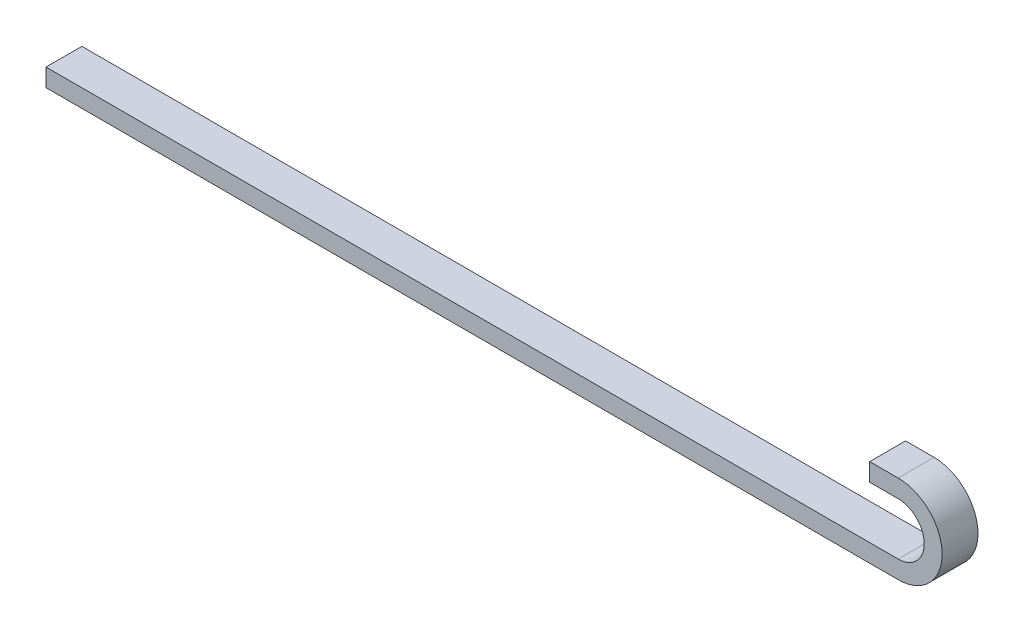
ISO-10303-21;
HEADER;
FILE_DESCRIPTION(('STEP AP214'),'2;1');
FILE_NAME('part.step','',(''),(''),'','','');
FILE_SCHEMA(('AUTOMOTIVE_DESIGN { 1 0 10303 214 1 1 1 1 }'));
ENDSEC;
DATA;
#1=APPLICATION_CONTEXT('core data for automotive mechanical design processes');
#2=APPLICATION_PROTOCOL_DEFINITION('international standard','automotive_design',2000,#1);
#3=PRODUCT_CONTEXT('',#1,'mechanical');
#4=PRODUCT('Part','Part','',(#3));
#5=PRODUCT_RELATED_PRODUCT_CATEGORY('part','',(#4));
#6=PRODUCT_DEFINITION_FORMATION('','',#4);
#7=PRODUCT_DEFINITION_CONTEXT('part definition',#1,'design');
#8=PRODUCT_DEFINITION('design','',#6,#7);
#9=PRODUCT_DEFINITION_SHAPE('','',#8);
#10=(LENGTH_UNIT() NAMED_UNIT(*) SI_UNIT(.MILLI.,.METRE.));
#11=(NAMED_UNIT(*) PLANE_ANGLE_UNIT() SI_UNIT($,.RADIAN.));
#12=(NAMED_UNIT(*) SI_UNIT($,.STERADIAN.) SOLID_ANGLE_UNIT());
#13=UNCERTAINTY_MEASURE_WITH_UNIT(LENGTH_MEASURE(1.E-05),#10,'distance_accuracy_value','');
#14=(GEOMETRIC_REPRESENTATION_CONTEXT(3) GLOBAL_UNCERTAINTY_ASSIGNED_CONTEXT((#13)) GLOBAL_UNIT_ASSIGNED_CONTEXT((#10,
#11,#12)) REPRESENTATION_CONTEXT('',''));
#15=CARTESIAN_POINT('',(0.,0.,0.));
#16=DIRECTION('',(0.,0.,1.));
#17=DIRECTION('',(1.,0.,0.));
#18=AXIS2_PLACEMENT_3D('',#15,#16,#17);
#19=CARTESIAN_POINT('',(-600.,0.,12.625));
#20=DIRECTION('',(1.,0.,0.));
#21=DIRECTION('',(0.,0.,-1.));
#22=AXIS2_PLACEMENT_3D('',#19,#20,#21);
#23=PLANE('',#22);
#24=DIRECTION('',(0.,-1.,0.));
#25=VECTOR('',#24,1.);
#26=CARTESIAN_POINT('',(-600.,0.,-12.625));
#27=LINE('',#26,#25);
#28=CARTESIAN_POINT('',(-600.,12.6,-12.625));
#29=VERTEX_POINT('',#28);
#30=CARTESIAN_POINT('',(-600.,0.,-12.625));
#31=VERTEX_POINT('',#30);
#32=EDGE_CURVE('E128',#29,#31,#27,.T.);
#33=ORIENTED_EDGE('',*,*,#32,.T.);
#34=DIRECTION('',(0.,0.,-1.));
#35=VECTOR('',#34,1.);
#36=CARTESIAN_POINT('',(-600.,0.,12.625));
#37=LINE('',#36,#35);
#38=CARTESIAN_POINT('',(-600.,0.,12.625));
#39=VERTEX_POINT('',#38);
#40=EDGE_CURVE('E11',#39,#31,#37,.T.);
#41=ORIENTED_EDGE('',*,*,#40,.F.);
#42=DIRECTION('',(0.,-1.,0.));
#43=VECTOR('',#42,1.);
#44=CARTESIAN_POINT('',(-600.,0.,12.625));
#45=LINE('',#44,#43);
#46=CARTESIAN_POINT('',(-600.,12.6,12.625));
#47=VERTEX_POINT('',#46);
#48=EDGE_CURVE('E142',#47,#39,#45,.T.);
#49=ORIENTED_EDGE('',*,*,#48,.F.);
#50=DIRECTION('',(0.,0.,-1.));
#51=VECTOR('',#50,1.);
#52=CARTESIAN_POINT('',(-600.,12.6,12.625));
#53=LINE('',#52,#51);
#54=EDGE_CURVE('E124',#47,#29,#53,.T.);
#55=ORIENTED_EDGE('',*,*,#54,.T.);
#56=EDGE_LOOP('',(#33,#41,#49,#55));
#57=FACE_BOUND('',#56,.T.);
#58=ADVANCED_FACE('F32',(#57),#23,.F.);
#59=CARTESIAN_POINT('',(-600.,0.,12.625));
#60=DIRECTION('',(0.,1.,0.));
#61=DIRECTION('',(0.,0.,1.));
#62=AXIS2_PLACEMENT_3D('',#59,#60,#61);
#63=PLANE('',#62);
#64=DIRECTION('',(1.,0.,0.));
#65=VECTOR('',#64,1.);
#66=CARTESIAN_POINT('',(-600.,0.,-12.625));
#67=LINE('',#66,#65);
#68=CARTESIAN_POINT('',(0.,0.,-12.625));
#69=VERTEX_POINT('',#68);
#70=EDGE_CURVE('E131',#31,#69,#67,.T.);
#71=ORIENTED_EDGE('',*,*,#70,.T.);
#72=DIRECTION('',(0.,0.,-1.));
#73=VECTOR('',#72,1.);
#74=CARTESIAN_POINT('',(0.,0.,12.625));
#75=LINE('',#74,#73);
#76=CARTESIAN_POINT('',(0.,0.,12.625));
#77=VERTEX_POINT('',#76);
#78=EDGE_CURVE('E40',#77,#69,#75,.T.);
#79=ORIENTED_EDGE('',*,*,#78,.F.);
#80=DIRECTION('',(1.,0.,0.));
#81=VECTOR('',#80,1.);
#82=CARTESIAN_POINT('',(-600.,0.,12.625));
#83=LINE('',#82,#81);
#84=EDGE_CURVE('E91',#39,#77,#83,.T.);
#85=ORIENTED_EDGE('',*,*,#84,.F.);
#86=ORIENTED_EDGE('',*,*,#40,.T.);
#87=EDGE_LOOP('',(#71,#79,#85,#86));
#88=FACE_BOUND('',#87,.T.);
#89=ADVANCED_FACE('F177',(#88),#63,.F.);
#90=CARTESIAN_POINT('',(0.,31.,12.625));
#91=DIRECTION('',(0.,0.,-1.));
#92=DIRECTION('',(-1.,0.,0.));
#93=AXIS2_PLACEMENT_3D('',#90,#91,#92);
#94=CYLINDRICAL_SURFACE('',#93,31.);
#95=CARTESIAN_POINT('',(0.,31.,-12.625));
#96=DIRECTION('',(0.,0.,1.));
#97=DIRECTION('',(1.,0.,0.));
#98=AXIS2_PLACEMENT_3D('',#95,#96,#97);
#99=CIRCLE('',#98,31.);
#100=CARTESIAN_POINT('',(0.,62.,-12.625));
#101=VERTEX_POINT('',#100);
#102=EDGE_CURVE('E133',#69,#101,#99,.T.);
#103=ORIENTED_EDGE('',*,*,#102,.T.);
#104=DIRECTION('',(0.,0.,-1.));
#105=VECTOR('',#104,1.);
#106=CARTESIAN_POINT('',(0.,62.,12.625));
#107=LINE('',#106,#105);
#108=CARTESIAN_POINT('',(0.,62.,12.625));
#109=VERTEX_POINT('',#108);
#110=EDGE_CURVE('E149',#109,#101,#107,.T.);
#111=ORIENTED_EDGE('',*,*,#110,.F.);
#112=CARTESIAN_POINT('',(0.,31.,12.625));
#113=DIRECTION('',(0.,0.,1.));
#114=DIRECTION('',(1.,0.,0.));
#115=AXIS2_PLACEMENT_3D('',#112,#113,#114);
#116=CIRCLE('',#115,31.);
#117=EDGE_CURVE('E157',#77,#109,#116,.T.);
#118=ORIENTED_EDGE('',*,*,#117,.F.);
#119=ORIENTED_EDGE('',*,*,#78,.T.);
#120=EDGE_LOOP('',(#103,#111,#118,#119));
#121=FACE_BOUND('',#120,.T.);
#122=ADVANCED_FACE('F155',(#121),#94,.T.);
#123=CARTESIAN_POINT('',(0.,62.,12.625));
#124=DIRECTION('',(0.,-1.,0.));
#125=DIRECTION('',(1.,0.,0.));
#126=AXIS2_PLACEMENT_3D('',#123,#124,#125);
#127=PLANE('',#126);
#128=DIRECTION('',(-1.,0.,0.));
#129=VECTOR('',#128,1.);
#130=CARTESIAN_POINT('',(0.,62.,-12.625));
#131=LINE('',#130,#129);
#132=CARTESIAN_POINT('',(-20.,62.,-12.625));
#133=VERTEX_POINT('',#132);
#134=EDGE_CURVE('E135',#101,#133,#131,.T.);
#135=ORIENTED_EDGE('',*,*,#134,.T.);
#136=DIRECTION('',(0.,0.,-1.));
#137=VECTOR('',#136,1.);
#138=CARTESIAN_POINT('',(-20.,62.,12.625));
#139=LINE('',#138,#137);
#140=CARTESIAN_POINT('',(-20.,62.,12.625));
#141=VERTEX_POINT('',#140);
#142=EDGE_CURVE('E146',#141,#133,#139,.T.);
#143=ORIENTED_EDGE('',*,*,#142,.F.);
#144=DIRECTION('',(-1.,0.,0.));
#145=VECTOR('',#144,1.);
#146=CARTESIAN_POINT('',(0.,62.,12.625));
#147=LINE('',#146,#145);
#148=EDGE_CURVE('E169',#109,#141,#147,.T.);
#149=ORIENTED_EDGE('',*,*,#148,.F.);
#150=ORIENTED_EDGE('',*,*,#110,.T.);
#151=EDGE_LOOP('',(#135,#143,#149,#150));
#152=FACE_BOUND('',#151,.T.);
#153=ADVANCED_FACE('F165',(#152),#127,.F.);
#154=CARTESIAN_POINT('',(-20.,49.4,12.625));
#155=DIRECTION('',(1.,0.,0.));
#156=DIRECTION('',(0.,0.,-1.));
#157=AXIS2_PLACEMENT_3D('',#154,#155,#156);
#158=PLANE('',#157);
#159=DIRECTION('',(0.,-1.,0.));
#160=VECTOR('',#159,1.);
#161=CARTESIAN_POINT('',(-20.,49.4,-12.625));
#162=LINE('',#161,#160);
#163=CARTESIAN_POINT('',(-20.,49.4,-12.625));
#164=VERTEX_POINT('',#163);
#165=EDGE_CURVE('E137',#133,#164,#162,.T.);
#166=ORIENTED_EDGE('',*,*,#165,.T.);
#167=DIRECTION('',(0.,0.,-1.));
#168=VECTOR('',#167,1.);
#169=CARTESIAN_POINT('',(-20.,49.4,12.625));
#170=LINE('',#169,#168);
#171=CARTESIAN_POINT('',(-20.,49.4,12.625));
#172=VERTEX_POINT('',#171);
#173=EDGE_CURVE('E119',#172,#164,#170,.T.);
#174=ORIENTED_EDGE('',*,*,#173,.F.);
#175=DIRECTION('',(0.,-1.,0.));
#176=VECTOR('',#175,1.);
#177=CARTESIAN_POINT('',(-20.,49.4,12.625));
#178=LINE('',#177,#176);
#179=EDGE_CURVE('E110',#141,#172,#178,.T.);
#180=ORIENTED_EDGE('',*,*,#179,.F.);
#181=ORIENTED_EDGE('',*,*,#142,.T.);
#182=EDGE_LOOP('',(#166,#174,#180,#181));
#183=FACE_BOUND('',#182,.T.);
#184=ADVANCED_FACE('F168',(#183),#158,.F.);
#185=CARTESIAN_POINT('',(0.,49.4,12.625));
#186=DIRECTION('',(0.,1.,0.));
#187=DIRECTION('',(0.,0.,1.));
#188=AXIS2_PLACEMENT_3D('',#185,#186,#187);
#189=PLANE('',#188);
#190=DIRECTION('',(1.,0.,0.));
#191=VECTOR('',#190,1.);
#192=CARTESIAN_POINT('',(0.,49.4,-12.625));
#193=LINE('',#192,#191);
#194=CARTESIAN_POINT('',(0.,49.4,-12.625));
#195=VERTEX_POINT('',#194);
#196=EDGE_CURVE('E118',#164,#195,#193,.T.);
#197=ORIENTED_EDGE('',*,*,#196,.T.);
#198=DIRECTION('',(0.,0.,-1.));
#199=VECTOR('',#198,1.);
#200=CARTESIAN_POINT('',(0.,49.4,12.625));
#201=LINE('',#200,#199);
#202=CARTESIAN_POINT('',(0.,49.4,12.625));
#203=VERTEX_POINT('',#202);
#204=EDGE_CURVE('E115',#203,#195,#201,.T.);
#205=ORIENTED_EDGE('',*,*,#204,.F.);
#206=DIRECTION('',(1.,0.,0.));
#207=VECTOR('',#206,1.);
#208=CARTESIAN_POINT('',(0.,49.4,12.625));
#209=LINE('',#208,#207);
#210=EDGE_CURVE('E104',#172,#203,#209,.T.);
#211=ORIENTED_EDGE('',*,*,#210,.F.);
#212=ORIENTED_EDGE('',*,*,#173,.T.);
#213=EDGE_LOOP('',(#197,#205,#211,#212));
#214=FACE_BOUND('',#213,.T.);
#215=ADVANCED_FACE('F116',(#214),#189,.F.);
#216=CARTESIAN_POINT('',(0.,31.,12.625));
#217=DIRECTION('',(0.,0.,-1.));
#218=DIRECTION('',(-1.,0.,0.));
#219=AXIS2_PLACEMENT_3D('',#216,#217,#218);
#220=CYLINDRICAL_SURFACE('',#219,18.4);
#221=CARTESIAN_POINT('',(0.,31.,-12.625));
#222=DIRECTION('',(0.,0.,-1.));
#223=DIRECTION('',(1.,0.,0.));
#224=AXIS2_PLACEMENT_3D('',#221,#222,#223);
#225=CIRCLE('',#224,18.4);
#226=CARTESIAN_POINT('',(0.,12.6,-12.625));
#227=VERTEX_POINT('',#226);
#228=EDGE_CURVE('E77',#195,#227,#225,.T.);
#229=ORIENTED_EDGE('',*,*,#228,.T.);
#230=DIRECTION('',(0.,0.,-1.));
#231=VECTOR('',#230,1.);
#232=CARTESIAN_POINT('',(0.,12.6,12.625));
#233=LINE('',#232,#231);
#234=CARTESIAN_POINT('',(0.,12.6,12.625));
#235=VERTEX_POINT('',#234);
#236=EDGE_CURVE('E120',#235,#227,#233,.T.);
#237=ORIENTED_EDGE('',*,*,#236,.F.);
#238=CARTESIAN_POINT('',(0.,31.,12.625));
#239=DIRECTION('',(0.,0.,-1.));
#240=DIRECTION('',(1.,0.,0.));
#241=AXIS2_PLACEMENT_3D('',#238,#239,#240);
#242=CIRCLE('',#241,18.4);
#243=EDGE_CURVE('E108',#203,#235,#242,.T.);
#244=ORIENTED_EDGE('',*,*,#243,.F.);
#245=ORIENTED_EDGE('',*,*,#204,.T.);
#246=EDGE_LOOP('',(#229,#237,#244,#245));
#247=FACE_BOUND('',#246,.T.);
#248=ADVANCED_FACE('F122',(#247),#220,.F.);
#249=CARTESIAN_POINT('',(-600.,12.6,12.625));
#250=DIRECTION('',(0.,-1.,0.));
#251=DIRECTION('',(0.,0.,-1.));
#252=AXIS2_PLACEMENT_3D('',#249,#250,#251);
#253=PLANE('',#252);
#254=DIRECTION('',(-1.,0.,0.));
#255=VECTOR('',#254,1.);
#256=CARTESIAN_POINT('',(-600.,12.6,-12.625));
#257=LINE('',#256,#255);
#258=EDGE_CURVE('E83',#227,#29,#257,.T.);
#259=ORIENTED_EDGE('',*,*,#258,.T.);
#260=ORIENTED_EDGE('',*,*,#54,.F.);
#261=DIRECTION('',(-1.,0.,0.));
#262=VECTOR('',#261,1.);
#263=CARTESIAN_POINT('',(-600.,12.6,12.625));
#264=LINE('',#263,#262);
#265=EDGE_CURVE('E48',#235,#47,#264,.T.);
#266=ORIENTED_EDGE('',*,*,#265,.F.);
#267=ORIENTED_EDGE('',*,*,#236,.T.);
#268=EDGE_LOOP('',(#259,#260,#266,#267));
#269=FACE_BOUND('',#268,.T.);
#270=ADVANCED_FACE('F193',(#269),#253,.F.);
#271=CARTESIAN_POINT('',(0.,31.,12.625));
#272=DIRECTION('',(0.,0.,1.));
#273=DIRECTION('',(1.,0.,0.));
#274=AXIS2_PLACEMENT_3D('',#271,#272,#273);
#275=PLANE('',#274);
#276=ORIENTED_EDGE('',*,*,#48,.T.);
#277=ORIENTED_EDGE('',*,*,#84,.T.);
#278=ORIENTED_EDGE('',*,*,#117,.T.);
#279=ORIENTED_EDGE('',*,*,#148,.T.);
#280=ORIENTED_EDGE('',*,*,#179,.T.);
#281=ORIENTED_EDGE('',*,*,#210,.T.);
#282=ORIENTED_EDGE('',*,*,#243,.T.);
#283=ORIENTED_EDGE('',*,*,#265,.T.);
#284=EDGE_LOOP('',(#276,#277,#278,#279,#280,#281,#282,#283));
#285=FACE_BOUND('',#284,.T.);
#286=ADVANCED_FACE('F106',(#285),#275,.T.);
#287=CARTESIAN_POINT('',(0.,31.,-12.625));
#288=DIRECTION('',(0.,0.,1.));
#289=DIRECTION('',(1.,0.,0.));
#290=AXIS2_PLACEMENT_3D('',#287,#288,#289);
#291=PLANE('',#290);
#292=ORIENTED_EDGE('',*,*,#32,.F.);
#293=ORIENTED_EDGE('',*,*,#258,.F.);
#294=ORIENTED_EDGE('',*,*,#228,.F.);
#295=ORIENTED_EDGE('',*,*,#196,.F.);
#296=ORIENTED_EDGE('',*,*,#165,.F.);
#297=ORIENTED_EDGE('',*,*,#134,.F.);
#298=ORIENTED_EDGE('',*,*,#102,.F.);
#299=ORIENTED_EDGE('',*,*,#70,.F.);
#300=EDGE_LOOP('',(#292,#293,#294,#295,#296,#297,#298,#299));
#301=FACE_BOUND('',#300,.T.);
#302=ADVANCED_FACE('F161',(#301),#291,.F.);
#303=CLOSED_SHELL('',(#58,#89,#122,#153,#184,#215,#248,#270,#286,#302));
#304=MANIFOLD_SOLID_BREP('B2',#303);
#305=ADVANCED_BREP_SHAPE_REPRESENTATION('',(#18,#304),#14);
#306=SHAPE_DEFINITION_REPRESENTATION(#9,#305);
ENDSEC;
END-ISO-10303-21;
